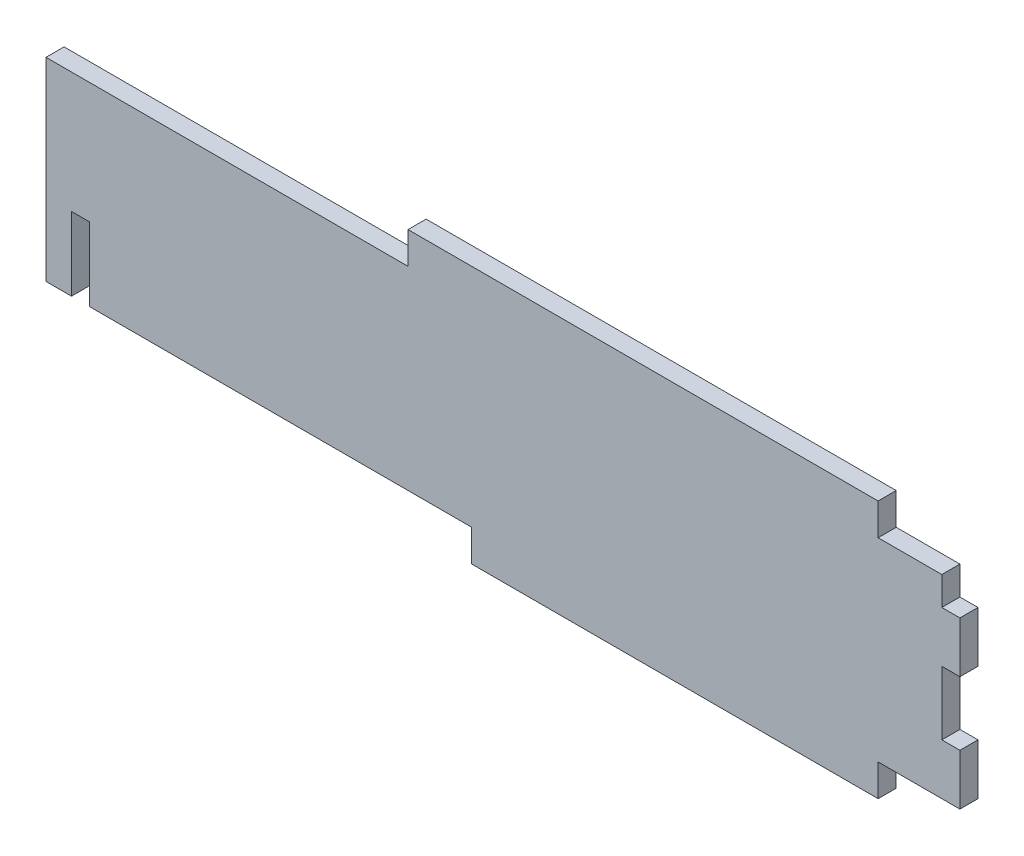
ISO-10303-21;
HEADER;
FILE_DESCRIPTION(('STEP AP214'),'2;1');
FILE_NAME('part.step','',(''),(''),'','','');
FILE_SCHEMA(('AUTOMOTIVE_DESIGN { 1 0 10303 214 1 1 1 1 }'));
ENDSEC;
DATA;
#1=APPLICATION_CONTEXT('core data for automotive mechanical design processes');
#2=APPLICATION_PROTOCOL_DEFINITION('international standard','automotive_design',2000,#1);
#3=PRODUCT_CONTEXT('',#1,'mechanical');
#4=PRODUCT('Part','Part','',(#3));
#5=PRODUCT_RELATED_PRODUCT_CATEGORY('part','',(#4));
#6=PRODUCT_DEFINITION_FORMATION('','',#4);
#7=PRODUCT_DEFINITION_CONTEXT('part definition',#1,'design');
#8=PRODUCT_DEFINITION('design','',#6,#7);
#9=PRODUCT_DEFINITION_SHAPE('','',#8);
#10=(LENGTH_UNIT() NAMED_UNIT(*) SI_UNIT(.MILLI.,.METRE.));
#11=(NAMED_UNIT(*) PLANE_ANGLE_UNIT() SI_UNIT($,.RADIAN.));
#12=(NAMED_UNIT(*) SI_UNIT($,.STERADIAN.) SOLID_ANGLE_UNIT());
#13=UNCERTAINTY_MEASURE_WITH_UNIT(LENGTH_MEASURE(1.E-05),#10,'distance_accuracy_value','');
#14=(GEOMETRIC_REPRESENTATION_CONTEXT(3) GLOBAL_UNCERTAINTY_ASSIGNED_CONTEXT((#13)) GLOBAL_UNIT_ASSIGNED_CONTEXT((#10,
#11,#12)) REPRESENTATION_CONTEXT('',''));
#15=CARTESIAN_POINT('',(0.,0.,0.));
#16=DIRECTION('',(0.,0.,1.));
#17=DIRECTION('',(1.,0.,0.));
#18=AXIS2_PLACEMENT_3D('',#15,#16,#17);
#19=CARTESIAN_POINT('',(1.8034,0.,1.8034));
#20=DIRECTION('',(1.,0.,0.));
#21=DIRECTION('',(0.,0.,-1.));
#22=AXIS2_PLACEMENT_3D('',#19,#20,#21);
#23=PLANE('',#22);
#24=DIRECTION('',(0.,-1.,0.));
#25=VECTOR('',#24,1.);
#26=CARTESIAN_POINT('',(1.8034,0.,0.));
#27=LINE('',#26,#25);
#28=CARTESIAN_POINT('',(1.8034,9.80439999999999,0.));
#29=VERTEX_POINT('',#28);
#30=CARTESIAN_POINT('',(1.8034,4.72439999999999,0.));
#31=VERTEX_POINT('',#30);
#32=EDGE_CURVE('E212',#29,#31,#27,.T.);
#33=ORIENTED_EDGE('',*,*,#32,.F.);
#34=DIRECTION('',(0.,0.,-1.));
#35=VECTOR('',#34,1.);
#36=CARTESIAN_POINT('',(1.8034,9.80439999999999,1.8034));
#37=LINE('',#36,#35);
#38=CARTESIAN_POINT('',(1.8034,9.80439999999999,1.8034));
#39=VERTEX_POINT('',#38);
#40=EDGE_CURVE('E11',#39,#29,#37,.T.);
#41=ORIENTED_EDGE('',*,*,#40,.F.);
#42=DIRECTION('',(0.,-1.,0.));
#43=VECTOR('',#42,1.);
#44=CARTESIAN_POINT('',(1.8034,0.,1.8034));
#45=LINE('',#44,#43);
#46=CARTESIAN_POINT('',(1.8034,4.72439999999999,1.8034));
#47=VERTEX_POINT('',#46);
#48=EDGE_CURVE('E264',#39,#47,#45,.T.);
#49=ORIENTED_EDGE('',*,*,#48,.T.);
#50=DIRECTION('',(0.,0.,-1.));
#51=VECTOR('',#50,1.);
#52=CARTESIAN_POINT('',(1.8034,4.72439999999999,1.8034));
#53=LINE('',#52,#51);
#54=EDGE_CURVE('E127',#47,#31,#53,.T.);
#55=ORIENTED_EDGE('',*,*,#54,.T.);
#56=EDGE_LOOP('',(#33,#41,#49,#55));
#57=FACE_BOUND('',#56,.T.);
#58=ADVANCED_FACE('F35',(#57),#23,.T.);
#59=CARTESIAN_POINT('',(0.,9.80439999999999,1.8034));
#60=DIRECTION('',(0.,-1.,0.));
#61=DIRECTION('',(0.,0.,-1.));
#62=AXIS2_PLACEMENT_3D('',#59,#60,#61);
#63=PLANE('',#62);
#64=DIRECTION('',(-1.,0.,0.));
#65=VECTOR('',#64,1.);
#66=CARTESIAN_POINT('',(0.,9.80439999999999,0.));
#67=LINE('',#66,#65);
#68=CARTESIAN_POINT('',(0.,9.80439999999999,0.));
#69=VERTEX_POINT('',#68);
#70=EDGE_CURVE('E215',#29,#69,#67,.T.);
#71=ORIENTED_EDGE('',*,*,#70,.T.);
#72=DIRECTION('',(0.,0.,-1.));
#73=VECTOR('',#72,1.);
#74=CARTESIAN_POINT('',(0.,9.80439999999999,1.8034));
#75=LINE('',#74,#73);
#76=CARTESIAN_POINT('',(0.,9.80439999999999,1.8034));
#77=VERTEX_POINT('',#76);
#78=EDGE_CURVE('E43',#77,#69,#75,.T.);
#79=ORIENTED_EDGE('',*,*,#78,.F.);
#80=DIRECTION('',(-1.,0.,0.));
#81=VECTOR('',#80,1.);
#82=CARTESIAN_POINT('',(0.,9.80439999999999,1.8034));
#83=LINE('',#82,#81);
#84=EDGE_CURVE('E331',#39,#77,#83,.T.);
#85=ORIENTED_EDGE('',*,*,#84,.F.);
#86=ORIENTED_EDGE('',*,*,#40,.T.);
#87=EDGE_LOOP('',(#71,#79,#85,#86));
#88=FACE_BOUND('',#87,.T.);
#89=ADVANCED_FACE('F318',(#88),#63,.F.);
#90=CARTESIAN_POINT('',(0.,0.,1.8034));
#91=DIRECTION('',(1.,0.,0.));
#92=DIRECTION('',(0.,0.,-1.));
#93=AXIS2_PLACEMENT_3D('',#90,#91,#92);
#94=PLANE('',#93);
#95=DIRECTION('',(0.,-1.,0.));
#96=VECTOR('',#95,1.);
#97=CARTESIAN_POINT('',(0.,0.,0.));
#98=LINE('',#97,#96);
#99=CARTESIAN_POINT('',(0.,16.1544,0.));
#100=VERTEX_POINT('',#99);
#101=EDGE_CURVE('E218',#100,#69,#98,.T.);
#102=ORIENTED_EDGE('',*,*,#101,.F.);
#103=DIRECTION('',(0.,0.,-1.));
#104=VECTOR('',#103,1.);
#105=CARTESIAN_POINT('',(0.,16.1544,1.8034));
#106=LINE('',#105,#104);
#107=CARTESIAN_POINT('',(0.,16.1544,1.8034));
#108=VERTEX_POINT('',#107);
#109=EDGE_CURVE('E308',#108,#100,#106,.T.);
#110=ORIENTED_EDGE('',*,*,#109,.F.);
#111=DIRECTION('',(0.,-1.,0.));
#112=VECTOR('',#111,1.);
#113=CARTESIAN_POINT('',(0.,0.,1.8034));
#114=LINE('',#113,#112);
#115=EDGE_CURVE('E315',#108,#77,#114,.T.);
#116=ORIENTED_EDGE('',*,*,#115,.T.);
#117=ORIENTED_EDGE('',*,*,#78,.T.);
#118=EDGE_LOOP('',(#102,#110,#116,#117));
#119=FACE_BOUND('',#118,.T.);
#120=ADVANCED_FACE('F313',(#119),#94,.T.);
#121=CARTESIAN_POINT('',(0.,16.1544,1.8034));
#122=DIRECTION('',(0.,-1.,0.));
#123=DIRECTION('',(0.,0.,-1.));
#124=AXIS2_PLACEMENT_3D('',#121,#122,#123);
#125=PLANE('',#124);
#126=DIRECTION('',(-1.,0.,0.));
#127=VECTOR('',#126,1.);
#128=CARTESIAN_POINT('',(0.,16.1544,0.));
#129=LINE('',#128,#127);
#130=CARTESIAN_POINT('',(1.8034,16.1544,0.));
#131=VERTEX_POINT('',#130);
#132=EDGE_CURVE('E221',#131,#100,#129,.T.);
#133=ORIENTED_EDGE('',*,*,#132,.F.);
#134=DIRECTION('',(0.,0.,-1.));
#135=VECTOR('',#134,1.);
#136=CARTESIAN_POINT('',(1.8034,16.1544,1.8034));
#137=LINE('',#136,#135);
#138=CARTESIAN_POINT('',(1.8034,16.1544,1.8034));
#139=VERTEX_POINT('',#138);
#140=EDGE_CURVE('E306',#139,#131,#137,.T.);
#141=ORIENTED_EDGE('',*,*,#140,.F.);
#142=DIRECTION('',(-1.,0.,0.));
#143=VECTOR('',#142,1.);
#144=CARTESIAN_POINT('',(0.,16.1544,1.8034));
#145=LINE('',#144,#143);
#146=EDGE_CURVE('E328',#139,#108,#145,.T.);
#147=ORIENTED_EDGE('',*,*,#146,.T.);
#148=ORIENTED_EDGE('',*,*,#109,.T.);
#149=EDGE_LOOP('',(#133,#141,#147,#148));
#150=FACE_BOUND('',#149,.T.);
#151=ADVANCED_FACE('F325',(#150),#125,.T.);
#152=CARTESIAN_POINT('',(1.8034,0.,1.8034));
#153=DIRECTION('',(1.,0.,0.));
#154=DIRECTION('',(0.,0.,-1.));
#155=AXIS2_PLACEMENT_3D('',#152,#153,#154);
#156=PLANE('',#155);
#157=DIRECTION('',(0.,-1.,0.));
#158=VECTOR('',#157,1.);
#159=CARTESIAN_POINT('',(1.8034,0.,0.));
#160=LINE('',#159,#158);
#161=CARTESIAN_POINT('',(1.8034,21.2344,0.));
#162=VERTEX_POINT('',#161);
#163=EDGE_CURVE('E224',#162,#131,#160,.T.);
#164=ORIENTED_EDGE('',*,*,#163,.F.);
#165=DIRECTION('',(0.,0.,-1.));
#166=VECTOR('',#165,1.);
#167=CARTESIAN_POINT('',(1.8034,21.2344,1.8034));
#168=LINE('',#167,#166);
#169=CARTESIAN_POINT('',(1.8034,21.2344,1.8034));
#170=VERTEX_POINT('',#169);
#171=EDGE_CURVE('E304',#170,#162,#168,.T.);
#172=ORIENTED_EDGE('',*,*,#171,.F.);
#173=DIRECTION('',(0.,-1.,0.));
#174=VECTOR('',#173,1.);
#175=CARTESIAN_POINT('',(1.8034,0.,1.8034));
#176=LINE('',#175,#174);
#177=EDGE_CURVE('E333',#170,#139,#176,.T.);
#178=ORIENTED_EDGE('',*,*,#177,.T.);
#179=ORIENTED_EDGE('',*,*,#140,.T.);
#180=EDGE_LOOP('',(#164,#172,#178,#179));
#181=FACE_BOUND('',#180,.T.);
#182=ADVANCED_FACE('F382',(#181),#156,.T.);
#183=CARTESIAN_POINT('',(0.,21.2344,1.8034));
#184=DIRECTION('',(0.,-1.,0.));
#185=DIRECTION('',(0.,0.,-1.));
#186=AXIS2_PLACEMENT_3D('',#183,#184,#185);
#187=PLANE('',#186);
#188=DIRECTION('',(-1.,0.,0.));
#189=VECTOR('',#188,1.);
#190=CARTESIAN_POINT('',(0.,21.2344,0.));
#191=LINE('',#190,#189);
#192=CARTESIAN_POINT('',(0.,21.2344,0.));
#193=VERTEX_POINT('',#192);
#194=EDGE_CURVE('E227',#162,#193,#191,.T.);
#195=ORIENTED_EDGE('',*,*,#194,.T.);
#196=DIRECTION('',(0.,0.,-1.));
#197=VECTOR('',#196,1.);
#198=CARTESIAN_POINT('',(0.,21.2344,1.8034));
#199=LINE('',#198,#197);
#200=CARTESIAN_POINT('',(0.,21.2344,1.8034));
#201=VERTEX_POINT('',#200);
#202=EDGE_CURVE('E302',#201,#193,#199,.T.);
#203=ORIENTED_EDGE('',*,*,#202,.F.);
#204=DIRECTION('',(-1.,0.,0.));
#205=VECTOR('',#204,1.);
#206=CARTESIAN_POINT('',(0.,21.2344,1.8034));
#207=LINE('',#206,#205);
#208=EDGE_CURVE('E339',#170,#201,#207,.T.);
#209=ORIENTED_EDGE('',*,*,#208,.F.);
#210=ORIENTED_EDGE('',*,*,#171,.T.);
#211=EDGE_LOOP('',(#195,#203,#209,#210));
#212=FACE_BOUND('',#211,.T.);
#213=ADVANCED_FACE('F385',(#212),#187,.F.);
#214=CARTESIAN_POINT('',(0.,0.,1.8034));
#215=DIRECTION('',(1.,0.,0.));
#216=DIRECTION('',(0.,0.,-1.));
#217=AXIS2_PLACEMENT_3D('',#214,#215,#216);
#218=PLANE('',#217);
#219=DIRECTION('',(0.,-1.,0.));
#220=VECTOR('',#219,1.);
#221=CARTESIAN_POINT('',(0.,0.,0.));
#222=LINE('',#221,#220);
#223=CARTESIAN_POINT('',(0.,24.0792,0.));
#224=VERTEX_POINT('',#223);
#225=EDGE_CURVE('E230',#224,#193,#222,.T.);
#226=ORIENTED_EDGE('',*,*,#225,.F.);
#227=DIRECTION('',(0.,0.,-1.));
#228=VECTOR('',#227,1.);
#229=CARTESIAN_POINT('',(0.,24.0792,1.8034));
#230=LINE('',#229,#228);
#231=CARTESIAN_POINT('',(0.,24.0792,1.8034));
#232=VERTEX_POINT('',#231);
#233=EDGE_CURVE('E300',#232,#224,#230,.T.);
#234=ORIENTED_EDGE('',*,*,#233,.F.);
#235=DIRECTION('',(0.,-1.,0.));
#236=VECTOR('',#235,1.);
#237=CARTESIAN_POINT('',(0.,0.,1.8034));
#238=LINE('',#237,#236);
#239=EDGE_CURVE('E341',#232,#201,#238,.T.);
#240=ORIENTED_EDGE('',*,*,#239,.T.);
#241=ORIENTED_EDGE('',*,*,#202,.T.);
#242=EDGE_LOOP('',(#226,#234,#240,#241));
#243=FACE_BOUND('',#242,.T.);
#244=ADVANCED_FACE('F389',(#243),#218,.T.);
#245=CARTESIAN_POINT('',(0.,24.0792,1.8034));
#246=DIRECTION('',(0.,-1.,0.));
#247=DIRECTION('',(1.,0.,0.));
#248=AXIS2_PLACEMENT_3D('',#245,#246,#247);
#249=PLANE('',#248);
#250=DIRECTION('',(-1.,0.,0.));
#251=VECTOR('',#250,1.);
#252=CARTESIAN_POINT('',(0.,24.0792,0.));
#253=LINE('',#252,#251);
#254=CARTESIAN_POINT('',(-6.35,24.0792,0.));
#255=VERTEX_POINT('',#254);
#256=EDGE_CURVE('E233',#224,#255,#253,.T.);
#257=ORIENTED_EDGE('',*,*,#256,.T.);
#258=DIRECTION('',(0.,0.,-1.));
#259=VECTOR('',#258,1.);
#260=CARTESIAN_POINT('',(-6.35,24.0792,1.8034));
#261=LINE('',#260,#259);
#262=CARTESIAN_POINT('',(-6.35,24.0792,1.8034));
#263=VERTEX_POINT('',#262);
#264=EDGE_CURVE('E297',#263,#255,#261,.T.);
#265=ORIENTED_EDGE('',*,*,#264,.F.);
#266=DIRECTION('',(-1.,0.,0.));
#267=VECTOR('',#266,1.);
#268=CARTESIAN_POINT('',(0.,24.0792,1.8034));
#269=LINE('',#268,#267);
#270=EDGE_CURVE('E344',#232,#263,#269,.T.);
#271=ORIENTED_EDGE('',*,*,#270,.F.);
#272=ORIENTED_EDGE('',*,*,#233,.T.);
#273=EDGE_LOOP('',(#257,#265,#271,#272));
#274=FACE_BOUND('',#273,.T.);
#275=ADVANCED_FACE('F393',(#274),#249,.F.);
#276=CARTESIAN_POINT('',(-6.34999999999999,0.,1.8034));
#277=DIRECTION('',(-1.,0.,0.));
#278=DIRECTION('',(0.,-1.,0.));
#279=AXIS2_PLACEMENT_3D('',#276,#277,#278);
#280=PLANE('',#279);
#281=DIRECTION('',(0.,1.,0.));
#282=VECTOR('',#281,1.);
#283=CARTESIAN_POINT('',(-6.34999999999999,0.,0.));
#284=LINE('',#283,#282);
#285=CARTESIAN_POINT('',(-6.35,27.2542,0.));
#286=VERTEX_POINT('',#285);
#287=EDGE_CURVE('E235',#255,#286,#284,.T.);
#288=ORIENTED_EDGE('',*,*,#287,.T.);
#289=DIRECTION('',(0.,0.,-1.));
#290=VECTOR('',#289,1.);
#291=CARTESIAN_POINT('',(-6.35,27.2542,1.8034));
#292=LINE('',#291,#290);
#293=CARTESIAN_POINT('',(-6.35,27.2542,1.8034));
#294=VERTEX_POINT('',#293);
#295=EDGE_CURVE('E294',#294,#286,#292,.T.);
#296=ORIENTED_EDGE('',*,*,#295,.F.);
#297=DIRECTION('',(0.,1.,0.));
#298=VECTOR('',#297,1.);
#299=CARTESIAN_POINT('',(-6.34999999999999,0.,1.8034));
#300=LINE('',#299,#298);
#301=EDGE_CURVE('E346',#263,#294,#300,.T.);
#302=ORIENTED_EDGE('',*,*,#301,.F.);
#303=ORIENTED_EDGE('',*,*,#264,.T.);
#304=EDGE_LOOP('',(#288,#296,#302,#303));
#305=FACE_BOUND('',#304,.T.);
#306=ADVANCED_FACE('F397',(#305),#280,.F.);
#307=CARTESIAN_POINT('',(0.,27.2542,1.8034));
#308=DIRECTION('',(0.,-1.,0.));
#309=DIRECTION('',(0.,0.,-1.));
#310=AXIS2_PLACEMENT_3D('',#307,#308,#309);
#311=PLANE('',#310);
#312=DIRECTION('',(-1.,0.,0.));
#313=VECTOR('',#312,1.);
#314=CARTESIAN_POINT('',(0.,27.2542,0.));
#315=LINE('',#314,#313);
#316=CARTESIAN_POINT('',(-53.213,27.2542,0.));
#317=VERTEX_POINT('',#316);
#318=EDGE_CURVE('E237',#286,#317,#315,.T.);
#319=ORIENTED_EDGE('',*,*,#318,.T.);
#320=DIRECTION('',(0.,0.,-1.));
#321=VECTOR('',#320,1.);
#322=CARTESIAN_POINT('',(-53.213,27.2542,1.8034));
#323=LINE('',#322,#321);
#324=CARTESIAN_POINT('',(-53.213,27.2542,1.8034));
#325=VERTEX_POINT('',#324);
#326=EDGE_CURVE('E291',#325,#317,#323,.T.);
#327=ORIENTED_EDGE('',*,*,#326,.F.);
#328=DIRECTION('',(-1.,0.,0.));
#329=VECTOR('',#328,1.);
#330=CARTESIAN_POINT('',(0.,27.2542,1.8034));
#331=LINE('',#330,#329);
#332=EDGE_CURVE('E348',#294,#325,#331,.T.);
#333=ORIENTED_EDGE('',*,*,#332,.F.);
#334=ORIENTED_EDGE('',*,*,#295,.T.);
#335=EDGE_LOOP('',(#319,#327,#333,#334));
#336=FACE_BOUND('',#335,.T.);
#337=ADVANCED_FACE('F401',(#336),#311,.F.);
#338=CARTESIAN_POINT('',(-53.213,0.,1.8034));
#339=DIRECTION('',(1.,0.,0.));
#340=DIRECTION('',(0.,0.,-1.));
#341=AXIS2_PLACEMENT_3D('',#338,#339,#340);
#342=PLANE('',#341);
#343=DIRECTION('',(0.,-1.,0.));
#344=VECTOR('',#343,1.);
#345=CARTESIAN_POINT('',(-53.213,0.,0.));
#346=LINE('',#345,#344);
#347=CARTESIAN_POINT('',(-53.213,24.0792,0.));
#348=VERTEX_POINT('',#347);
#349=EDGE_CURVE('E239',#317,#348,#346,.T.);
#350=ORIENTED_EDGE('',*,*,#349,.T.);
#351=DIRECTION('',(0.,0.,-1.));
#352=VECTOR('',#351,1.);
#353=CARTESIAN_POINT('',(-53.213,24.0792,1.8034));
#354=LINE('',#353,#352);
#355=CARTESIAN_POINT('',(-53.213,24.0792,1.8034));
#356=VERTEX_POINT('',#355);
#357=EDGE_CURVE('E288',#356,#348,#354,.T.);
#358=ORIENTED_EDGE('',*,*,#357,.F.);
#359=DIRECTION('',(0.,-1.,0.));
#360=VECTOR('',#359,1.);
#361=CARTESIAN_POINT('',(-53.213,0.,1.8034));
#362=LINE('',#361,#360);
#363=EDGE_CURVE('E350',#325,#356,#362,.T.);
#364=ORIENTED_EDGE('',*,*,#363,.F.);
#365=ORIENTED_EDGE('',*,*,#326,.T.);
#366=EDGE_LOOP('',(#350,#358,#364,#365));
#367=FACE_BOUND('',#366,.T.);
#368=ADVANCED_FACE('F405',(#367),#342,.F.);
#369=CARTESIAN_POINT('',(0.,24.0792,1.8034));
#370=DIRECTION('',(0.,-1.,0.));
#371=DIRECTION('',(0.,0.,-1.));
#372=AXIS2_PLACEMENT_3D('',#369,#370,#371);
#373=PLANE('',#372);
#374=DIRECTION('',(-1.,0.,0.));
#375=VECTOR('',#374,1.);
#376=CARTESIAN_POINT('',(0.,24.0792,0.));
#377=LINE('',#376,#375);
#378=CARTESIAN_POINT('',(-89.3064,24.0792,0.));
#379=VERTEX_POINT('',#378);
#380=EDGE_CURVE('E241',#348,#379,#377,.T.);
#381=ORIENTED_EDGE('',*,*,#380,.T.);
#382=DIRECTION('',(0.,0.,-1.));
#383=VECTOR('',#382,1.);
#384=CARTESIAN_POINT('',(-89.3064,24.0792,1.8034));
#385=LINE('',#384,#383);
#386=CARTESIAN_POINT('',(-89.3064,24.0792,1.8034));
#387=VERTEX_POINT('',#386);
#388=EDGE_CURVE('E285',#387,#379,#385,.T.);
#389=ORIENTED_EDGE('',*,*,#388,.F.);
#390=DIRECTION('',(-1.,0.,0.));
#391=VECTOR('',#390,1.);
#392=CARTESIAN_POINT('',(0.,24.0792,1.8034));
#393=LINE('',#392,#391);
#394=EDGE_CURVE('E352',#356,#387,#393,.T.);
#395=ORIENTED_EDGE('',*,*,#394,.F.);
#396=ORIENTED_EDGE('',*,*,#357,.T.);
#397=EDGE_LOOP('',(#381,#389,#395,#396));
#398=FACE_BOUND('',#397,.T.);
#399=ADVANCED_FACE('F409',(#398),#373,.F.);
#400=CARTESIAN_POINT('',(-89.3064,0.,1.8034));
#401=DIRECTION('',(1.,0.,0.));
#402=DIRECTION('',(0.,0.,-1.));
#403=AXIS2_PLACEMENT_3D('',#400,#401,#402);
#404=PLANE('',#403);
#405=DIRECTION('',(0.,-1.,0.));
#406=VECTOR('',#405,1.);
#407=CARTESIAN_POINT('',(-89.3064,0.,0.));
#408=LINE('',#407,#406);
#409=CARTESIAN_POINT('',(-89.3064,4.72440000000001,0.));
#410=VERTEX_POINT('',#409);
#411=EDGE_CURVE('E243',#379,#410,#408,.T.);
#412=ORIENTED_EDGE('',*,*,#411,.T.);
#413=DIRECTION('',(0.,0.,-1.));
#414=VECTOR('',#413,1.);
#415=CARTESIAN_POINT('',(-89.3064,4.72440000000001,1.8034));
#416=LINE('',#415,#414);
#417=CARTESIAN_POINT('',(-89.3064,4.72440000000001,1.8034));
#418=VERTEX_POINT('',#417);
#419=EDGE_CURVE('E282',#418,#410,#416,.T.);
#420=ORIENTED_EDGE('',*,*,#419,.F.);
#421=DIRECTION('',(0.,-1.,0.));
#422=VECTOR('',#421,1.);
#423=CARTESIAN_POINT('',(-89.3064,0.,1.8034));
#424=LINE('',#423,#422);
#425=EDGE_CURVE('E354',#387,#418,#424,.T.);
#426=ORIENTED_EDGE('',*,*,#425,.F.);
#427=ORIENTED_EDGE('',*,*,#388,.T.);
#428=EDGE_LOOP('',(#412,#420,#426,#427));
#429=FACE_BOUND('',#428,.T.);
#430=ADVANCED_FACE('F413',(#429),#404,.F.);
#431=CARTESIAN_POINT('',(0.,4.72440000000001,1.8034));
#432=DIRECTION('',(0.,1.,0.));
#433=DIRECTION('',(0.,0.,1.));
#434=AXIS2_PLACEMENT_3D('',#431,#432,#433);
#435=PLANE('',#434);
#436=DIRECTION('',(1.,0.,0.));
#437=VECTOR('',#436,1.);
#438=CARTESIAN_POINT('',(0.,4.72440000000001,0.));
#439=LINE('',#438,#437);
#440=CARTESIAN_POINT('',(-86.7664,4.72440000000001,0.));
#441=VERTEX_POINT('',#440);
#442=EDGE_CURVE('E245',#410,#441,#439,.T.);
#443=ORIENTED_EDGE('',*,*,#442,.T.);
#444=DIRECTION('',(0.,0.,-1.));
#445=VECTOR('',#444,1.);
#446=CARTESIAN_POINT('',(-86.7664,4.72440000000001,1.8034));
#447=LINE('',#446,#445);
#448=CARTESIAN_POINT('',(-86.7664,4.72440000000001,1.8034));
#449=VERTEX_POINT('',#448);
#450=EDGE_CURVE('E279',#449,#441,#447,.T.);
#451=ORIENTED_EDGE('',*,*,#450,.F.);
#452=DIRECTION('',(1.,0.,0.));
#453=VECTOR('',#452,1.);
#454=CARTESIAN_POINT('',(0.,4.72440000000001,1.8034));
#455=LINE('',#454,#453);
#456=EDGE_CURVE('E356',#418,#449,#455,.T.);
#457=ORIENTED_EDGE('',*,*,#456,.F.);
#458=ORIENTED_EDGE('',*,*,#419,.T.);
#459=EDGE_LOOP('',(#443,#451,#457,#458));
#460=FACE_BOUND('',#459,.T.);
#461=ADVANCED_FACE('F417',(#460),#435,.F.);
#462=CARTESIAN_POINT('',(-86.7664,-1.6460598316491E-13,1.8034));
#463=DIRECTION('',(-1.,0.,0.));
#464=DIRECTION('',(0.,-1.,0.));
#465=AXIS2_PLACEMENT_3D('',#462,#463,#464);
#466=PLANE('',#465);
#467=DIRECTION('',(0.,1.,0.));
#468=VECTOR('',#467,1.);
#469=CARTESIAN_POINT('',(-86.7664,-1.6460598316491E-13,0.));
#470=LINE('',#469,#468);
#471=CARTESIAN_POINT('',(-86.7664,12.0396,0.));
#472=VERTEX_POINT('',#471);
#473=EDGE_CURVE('E247',#441,#472,#470,.T.);
#474=ORIENTED_EDGE('',*,*,#473,.T.);
#475=DIRECTION('',(0.,0.,-1.));
#476=VECTOR('',#475,1.);
#477=CARTESIAN_POINT('',(-86.7664,12.0396,1.8034));
#478=LINE('',#477,#476);
#479=CARTESIAN_POINT('',(-86.7664,12.0396,1.8034));
#480=VERTEX_POINT('',#479);
#481=EDGE_CURVE('E276',#480,#472,#478,.T.);
#482=ORIENTED_EDGE('',*,*,#481,.F.);
#483=DIRECTION('',(0.,1.,0.));
#484=VECTOR('',#483,1.);
#485=CARTESIAN_POINT('',(-86.7664,-1.6460598316491E-13,1.8034));
#486=LINE('',#485,#484);
#487=EDGE_CURVE('E358',#449,#480,#486,.T.);
#488=ORIENTED_EDGE('',*,*,#487,.F.);
#489=ORIENTED_EDGE('',*,*,#450,.T.);
#490=EDGE_LOOP('',(#474,#482,#488,#489));
#491=FACE_BOUND('',#490,.T.);
#492=ADVANCED_FACE('F421',(#491),#466,.F.);
#493=CARTESIAN_POINT('',(0.,12.0396,1.8034));
#494=DIRECTION('',(0.,1.,0.));
#495=DIRECTION('',(0.,0.,1.));
#496=AXIS2_PLACEMENT_3D('',#493,#494,#495);
#497=PLANE('',#496);
#498=DIRECTION('',(1.,0.,0.));
#499=VECTOR('',#498,1.);
#500=CARTESIAN_POINT('',(0.,12.0396,0.));
#501=LINE('',#500,#499);
#502=CARTESIAN_POINT('',(-84.963,12.0396,0.));
#503=VERTEX_POINT('',#502);
#504=EDGE_CURVE('E249',#472,#503,#501,.T.);
#505=ORIENTED_EDGE('',*,*,#504,.T.);
#506=DIRECTION('',(0.,0.,-1.));
#507=VECTOR('',#506,1.);
#508=CARTESIAN_POINT('',(-84.963,12.0396,1.8034));
#509=LINE('',#508,#507);
#510=CARTESIAN_POINT('',(-84.963,12.0396,1.8034));
#511=VERTEX_POINT('',#510);
#512=EDGE_CURVE('E273',#511,#503,#509,.T.);
#513=ORIENTED_EDGE('',*,*,#512,.F.);
#514=DIRECTION('',(1.,0.,0.));
#515=VECTOR('',#514,1.);
#516=CARTESIAN_POINT('',(0.,12.0396,1.8034));
#517=LINE('',#516,#515);
#518=EDGE_CURVE('E360',#480,#511,#517,.T.);
#519=ORIENTED_EDGE('',*,*,#518,.F.);
#520=ORIENTED_EDGE('',*,*,#481,.T.);
#521=EDGE_LOOP('',(#505,#513,#519,#520));
#522=FACE_BOUND('',#521,.T.);
#523=ADVANCED_FACE('F425',(#522),#497,.F.);
#524=CARTESIAN_POINT('',(-84.963,0.,1.8034));
#525=DIRECTION('',(1.,0.,0.));
#526=DIRECTION('',(0.,0.,-1.));
#527=AXIS2_PLACEMENT_3D('',#524,#525,#526);
#528=PLANE('',#527);
#529=DIRECTION('',(0.,-1.,0.));
#530=VECTOR('',#529,1.);
#531=CARTESIAN_POINT('',(-84.963,0.,0.));
#532=LINE('',#531,#530);
#533=CARTESIAN_POINT('',(-84.963,4.7244,0.));
#534=VERTEX_POINT('',#533);
#535=EDGE_CURVE('E251',#503,#534,#532,.T.);
#536=ORIENTED_EDGE('',*,*,#535,.T.);
#537=DIRECTION('',(0.,0.,-1.));
#538=VECTOR('',#537,1.);
#539=CARTESIAN_POINT('',(-84.963,4.7244,1.8034));
#540=LINE('',#539,#538);
#541=CARTESIAN_POINT('',(-84.963,4.7244,1.8034));
#542=VERTEX_POINT('',#541);
#543=EDGE_CURVE('E270',#542,#534,#540,.T.);
#544=ORIENTED_EDGE('',*,*,#543,.F.);
#545=DIRECTION('',(0.,-1.,0.));
#546=VECTOR('',#545,1.);
#547=CARTESIAN_POINT('',(-84.963,0.,1.8034));
#548=LINE('',#547,#546);
#549=EDGE_CURVE('E362',#511,#542,#548,.T.);
#550=ORIENTED_EDGE('',*,*,#549,.F.);
#551=ORIENTED_EDGE('',*,*,#512,.T.);
#552=EDGE_LOOP('',(#536,#544,#550,#551));
#553=FACE_BOUND('',#552,.T.);
#554=ADVANCED_FACE('F429',(#553),#528,.F.);
#555=CARTESIAN_POINT('',(0.,4.7244,1.8034));
#556=DIRECTION('',(0.,1.,0.));
#557=DIRECTION('',(0.,0.,1.));
#558=AXIS2_PLACEMENT_3D('',#555,#556,#557);
#559=PLANE('',#558);
#560=DIRECTION('',(1.,0.,0.));
#561=VECTOR('',#560,1.);
#562=CARTESIAN_POINT('',(0.,4.7244,0.));
#563=LINE('',#562,#561);
#564=CARTESIAN_POINT('',(-46.863,4.7244,0.));
#565=VERTEX_POINT('',#564);
#566=EDGE_CURVE('E253',#534,#565,#563,.T.);
#567=ORIENTED_EDGE('',*,*,#566,.T.);
#568=DIRECTION('',(0.,0.,-1.));
#569=VECTOR('',#568,1.);
#570=CARTESIAN_POINT('',(-46.863,4.7244,1.8034));
#571=LINE('',#570,#569);
#572=CARTESIAN_POINT('',(-46.863,4.7244,1.8034));
#573=VERTEX_POINT('',#572);
#574=EDGE_CURVE('E268',#573,#565,#571,.T.);
#575=ORIENTED_EDGE('',*,*,#574,.F.);
#576=DIRECTION('',(1.,0.,0.));
#577=VECTOR('',#576,1.);
#578=CARTESIAN_POINT('',(0.,4.7244,1.8034));
#579=LINE('',#578,#577);
#580=EDGE_CURVE('E364',#542,#573,#579,.T.);
#581=ORIENTED_EDGE('',*,*,#580,.F.);
#582=ORIENTED_EDGE('',*,*,#543,.T.);
#583=EDGE_LOOP('',(#567,#575,#581,#582));
#584=FACE_BOUND('',#583,.T.);
#585=ADVANCED_FACE('F433',(#584),#559,.F.);
#586=CARTESIAN_POINT('',(-46.863,0.,1.8034));
#587=DIRECTION('',(-1.,0.,0.));
#588=DIRECTION('',(0.,0.,1.));
#589=AXIS2_PLACEMENT_3D('',#586,#587,#588);
#590=PLANE('',#589);
#591=DIRECTION('',(0.,1.,0.));
#592=VECTOR('',#591,1.);
#593=CARTESIAN_POINT('',(-46.863,0.,0.));
#594=LINE('',#593,#592);
#595=CARTESIAN_POINT('',(-46.863,1.5494,0.));
#596=VERTEX_POINT('',#595);
#597=EDGE_CURVE('E256',#596,#565,#594,.T.);
#598=ORIENTED_EDGE('',*,*,#597,.F.);
#599=DIRECTION('',(0.,0.,-1.));
#600=VECTOR('',#599,1.);
#601=CARTESIAN_POINT('',(-46.863,1.5494,1.8034));
#602=LINE('',#601,#600);
#603=CARTESIAN_POINT('',(-46.863,1.5494,1.8034));
#604=VERTEX_POINT('',#603);
#605=EDGE_CURVE('E199',#604,#596,#602,.T.);
#606=ORIENTED_EDGE('',*,*,#605,.F.);
#607=DIRECTION('',(0.,1.,0.));
#608=VECTOR('',#607,1.);
#609=CARTESIAN_POINT('',(-46.863,0.,1.8034));
#610=LINE('',#609,#608);
#611=EDGE_CURVE('E205',#604,#573,#610,.T.);
#612=ORIENTED_EDGE('',*,*,#611,.T.);
#613=ORIENTED_EDGE('',*,*,#574,.T.);
#614=EDGE_LOOP('',(#598,#606,#612,#613));
#615=FACE_BOUND('',#614,.T.);
#616=ADVANCED_FACE('F367',(#615),#590,.T.);
#617=CARTESIAN_POINT('',(0.,1.5494,1.8034));
#618=DIRECTION('',(0.,-1.,0.));
#619=DIRECTION('',(1.,0.,0.));
#620=AXIS2_PLACEMENT_3D('',#617,#618,#619);
#621=PLANE('',#620);
#622=DIRECTION('',(-1.,0.,0.));
#623=VECTOR('',#622,1.);
#624=CARTESIAN_POINT('',(0.,1.5494,0.));
#625=LINE('',#624,#623);
#626=CARTESIAN_POINT('',(-6.35,1.5494,0.));
#627=VERTEX_POINT('',#626);
#628=EDGE_CURVE('E194',#627,#596,#625,.T.);
#629=ORIENTED_EDGE('',*,*,#628,.F.);
#630=DIRECTION('',(0.,0.,-1.));
#631=VECTOR('',#630,1.);
#632=CARTESIAN_POINT('',(-6.35,1.5494,1.8034));
#633=LINE('',#632,#631);
#634=CARTESIAN_POINT('',(-6.35,1.5494,1.8034));
#635=VERTEX_POINT('',#634);
#636=EDGE_CURVE('E189',#635,#627,#633,.T.);
#637=ORIENTED_EDGE('',*,*,#636,.F.);
#638=DIRECTION('',(-1.,0.,0.));
#639=VECTOR('',#638,1.);
#640=CARTESIAN_POINT('',(0.,1.5494,1.8034));
#641=LINE('',#640,#639);
#642=EDGE_CURVE('E192',#635,#604,#641,.T.);
#643=ORIENTED_EDGE('',*,*,#642,.T.);
#644=ORIENTED_EDGE('',*,*,#605,.T.);
#645=EDGE_LOOP('',(#629,#637,#643,#644));
#646=FACE_BOUND('',#645,.T.);
#647=ADVANCED_FACE('F191',(#646),#621,.T.);
#648=CARTESIAN_POINT('',(-6.35,0.,1.8034));
#649=DIRECTION('',(1.,0.,0.));
#650=DIRECTION('',(0.,0.,-1.));
#651=AXIS2_PLACEMENT_3D('',#648,#649,#650);
#652=PLANE('',#651);
#653=DIRECTION('',(0.,-1.,0.));
#654=VECTOR('',#653,1.);
#655=CARTESIAN_POINT('',(-6.35,0.,0.));
#656=LINE('',#655,#654);
#657=CARTESIAN_POINT('',(-6.35,4.7244,0.));
#658=VERTEX_POINT('',#657);
#659=EDGE_CURVE('E260',#658,#627,#656,.T.);
#660=ORIENTED_EDGE('',*,*,#659,.F.);
#661=DIRECTION('',(0.,0.,-1.));
#662=VECTOR('',#661,1.);
#663=CARTESIAN_POINT('',(-6.35,4.7244,1.8034));
#664=LINE('',#663,#662);
#665=CARTESIAN_POINT('',(-6.35,4.7244,1.8034));
#666=VERTEX_POINT('',#665);
#667=EDGE_CURVE('E120',#666,#658,#664,.T.);
#668=ORIENTED_EDGE('',*,*,#667,.F.);
#669=DIRECTION('',(0.,-1.,0.));
#670=VECTOR('',#669,1.);
#671=CARTESIAN_POINT('',(-6.35,0.,1.8034));
#672=LINE('',#671,#670);
#673=EDGE_CURVE('E203',#666,#635,#672,.T.);
#674=ORIENTED_EDGE('',*,*,#673,.T.);
#675=ORIENTED_EDGE('',*,*,#636,.T.);
#676=EDGE_LOOP('',(#660,#668,#674,#675));
#677=FACE_BOUND('',#676,.T.);
#678=ADVANCED_FACE('F207',(#677),#652,.T.);
#679=CARTESIAN_POINT('',(0.,4.72439999999999,1.8034));
#680=DIRECTION('',(0.,1.,0.));
#681=DIRECTION('',(-1.,0.,0.));
#682=AXIS2_PLACEMENT_3D('',#679,#680,#681);
#683=PLANE('',#682);
#684=DIRECTION('',(1.,0.,0.));
#685=VECTOR('',#684,1.);
#686=CARTESIAN_POINT('',(0.,4.72439999999999,0.));
#687=LINE('',#686,#685);
#688=EDGE_CURVE('E262',#658,#31,#687,.T.);
#689=ORIENTED_EDGE('',*,*,#688,.T.);
#690=ORIENTED_EDGE('',*,*,#54,.F.);
#691=DIRECTION('',(1.,0.,0.));
#692=VECTOR('',#691,1.);
#693=CARTESIAN_POINT('',(0.,4.72439999999999,1.8034));
#694=LINE('',#693,#692);
#695=EDGE_CURVE('E51',#666,#47,#694,.T.);
#696=ORIENTED_EDGE('',*,*,#695,.F.);
#697=ORIENTED_EDGE('',*,*,#667,.T.);
#698=EDGE_LOOP('',(#689,#690,#696,#697));
#699=FACE_BOUND('',#698,.T.);
#700=ADVANCED_FACE('F370',(#699),#683,.F.);
#701=CARTESIAN_POINT('',(0.,0.,1.8034));
#702=DIRECTION('',(0.,0.,1.));
#703=DIRECTION('',(1.,0.,0.));
#704=AXIS2_PLACEMENT_3D('',#701,#702,#703);
#705=PLANE('',#704);
#706=ORIENTED_EDGE('',*,*,#48,.F.);
#707=ORIENTED_EDGE('',*,*,#84,.T.);
#708=ORIENTED_EDGE('',*,*,#115,.F.);
#709=ORIENTED_EDGE('',*,*,#146,.F.);
#710=ORIENTED_EDGE('',*,*,#177,.F.);
#711=ORIENTED_EDGE('',*,*,#208,.T.);
#712=ORIENTED_EDGE('',*,*,#239,.F.);
#713=ORIENTED_EDGE('',*,*,#270,.T.);
#714=ORIENTED_EDGE('',*,*,#301,.T.);
#715=ORIENTED_EDGE('',*,*,#332,.T.);
#716=ORIENTED_EDGE('',*,*,#363,.T.);
#717=ORIENTED_EDGE('',*,*,#394,.T.);
#718=ORIENTED_EDGE('',*,*,#425,.T.);
#719=ORIENTED_EDGE('',*,*,#456,.T.);
#720=ORIENTED_EDGE('',*,*,#487,.T.);
#721=ORIENTED_EDGE('',*,*,#518,.T.);
#722=ORIENTED_EDGE('',*,*,#549,.T.);
#723=ORIENTED_EDGE('',*,*,#580,.T.);
#724=ORIENTED_EDGE('',*,*,#611,.F.);
#725=ORIENTED_EDGE('',*,*,#642,.F.);
#726=ORIENTED_EDGE('',*,*,#673,.F.);
#727=ORIENTED_EDGE('',*,*,#695,.T.);
#728=EDGE_LOOP('',(#706,#707,#708,#709,#710,#711,#712,#713,#714,#715,#716,#717,#718,#719,#720,
#721,#722,#723,#724,#725,#726,#727));
#729=FACE_BOUND('',#728,.T.);
#730=ADVANCED_FACE('F202',(#729),#705,.T.);
#731=CARTESIAN_POINT('',(0.,0.,0.));
#732=DIRECTION('',(0.,0.,1.));
#733=DIRECTION('',(1.,0.,0.));
#734=AXIS2_PLACEMENT_3D('',#731,#732,#733);
#735=PLANE('',#734);
#736=ORIENTED_EDGE('',*,*,#32,.T.);
#737=ORIENTED_EDGE('',*,*,#688,.F.);
#738=ORIENTED_EDGE('',*,*,#659,.T.);
#739=ORIENTED_EDGE('',*,*,#628,.T.);
#740=ORIENTED_EDGE('',*,*,#597,.T.);
#741=ORIENTED_EDGE('',*,*,#566,.F.);
#742=ORIENTED_EDGE('',*,*,#535,.F.);
#743=ORIENTED_EDGE('',*,*,#504,.F.);
#744=ORIENTED_EDGE('',*,*,#473,.F.);
#745=ORIENTED_EDGE('',*,*,#442,.F.);
#746=ORIENTED_EDGE('',*,*,#411,.F.);
#747=ORIENTED_EDGE('',*,*,#380,.F.);
#748=ORIENTED_EDGE('',*,*,#349,.F.);
#749=ORIENTED_EDGE('',*,*,#318,.F.);
#750=ORIENTED_EDGE('',*,*,#287,.F.);
#751=ORIENTED_EDGE('',*,*,#256,.F.);
#752=ORIENTED_EDGE('',*,*,#225,.T.);
#753=ORIENTED_EDGE('',*,*,#194,.F.);
#754=ORIENTED_EDGE('',*,*,#163,.T.);
#755=ORIENTED_EDGE('',*,*,#132,.T.);
#756=ORIENTED_EDGE('',*,*,#101,.T.);
#757=ORIENTED_EDGE('',*,*,#70,.F.);
#758=EDGE_LOOP('',(#736,#737,#738,#739,#740,#741,#742,#743,#744,#745,#746,#747,#748,#749,#750,
#751,#752,#753,#754,#755,#756,#757));
#759=FACE_BOUND('',#758,.T.);
#760=ADVANCED_FACE('F320',(#759),#735,.F.);
#761=CLOSED_SHELL('',(#58,#89,#120,#151,#182,#213,#244,#275,#306,#337,#368,#399,#430,#461,#492,
#523,#554,#585,#616,#647,#678,#700,#730,#760));
#762=MANIFOLD_SOLID_BREP('B2',#761);
#763=ADVANCED_BREP_SHAPE_REPRESENTATION('',(#18,#762),#14);
#764=SHAPE_DEFINITION_REPRESENTATION(#9,#763);
ENDSEC;
END-ISO-10303-21;
